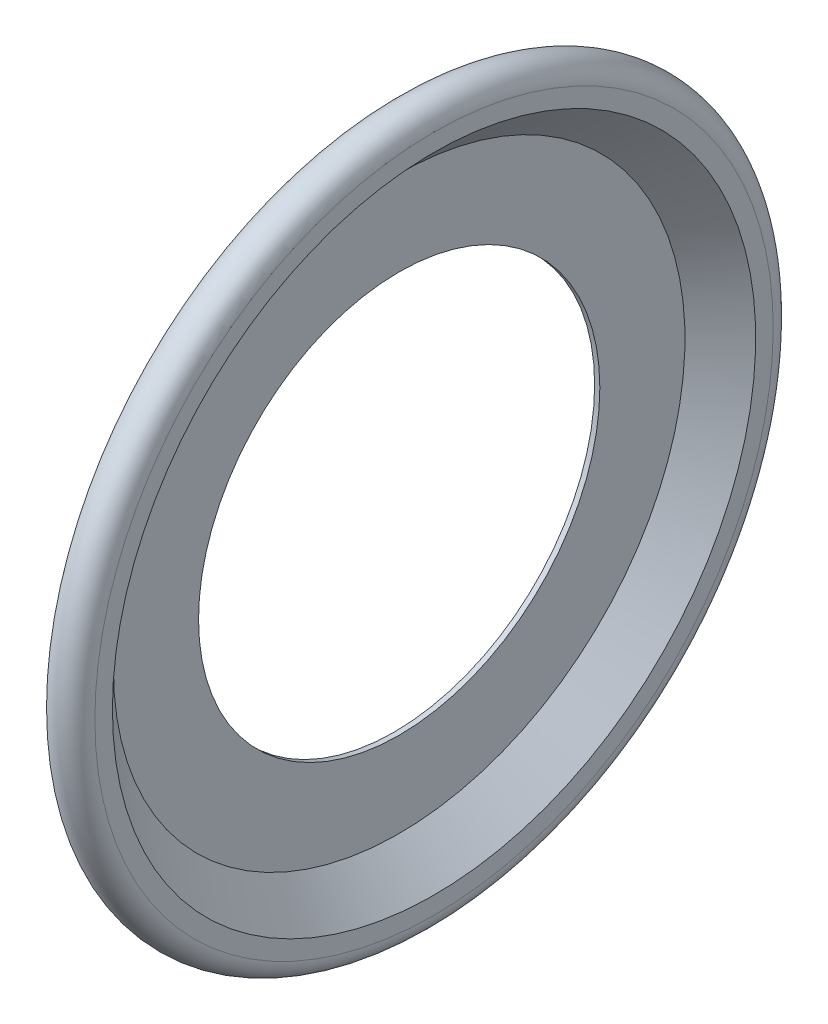
ISO-10303-21;
HEADER;
FILE_DESCRIPTION(('STEP AP214'),'2;1');
FILE_NAME('part.step','',(''),(''),'','','');
FILE_SCHEMA(('AUTOMOTIVE_DESIGN { 1 0 10303 214 1 1 1 1 }'));
ENDSEC;
DATA;
#1=APPLICATION_CONTEXT('core data for automotive mechanical design processes');
#2=APPLICATION_PROTOCOL_DEFINITION('international standard','automotive_design',2000,#1);
#3=PRODUCT_CONTEXT('',#1,'mechanical');
#4=PRODUCT('Part','Part','',(#3));
#5=PRODUCT_RELATED_PRODUCT_CATEGORY('part','',(#4));
#6=PRODUCT_DEFINITION_FORMATION('','',#4);
#7=PRODUCT_DEFINITION_CONTEXT('part definition',#1,'design');
#8=PRODUCT_DEFINITION('design','',#6,#7);
#9=PRODUCT_DEFINITION_SHAPE('','',#8);
#10=(LENGTH_UNIT() NAMED_UNIT(*) SI_UNIT(.MILLI.,.METRE.));
#11=(NAMED_UNIT(*) PLANE_ANGLE_UNIT() SI_UNIT($,.RADIAN.));
#12=(NAMED_UNIT(*) SI_UNIT($,.STERADIAN.) SOLID_ANGLE_UNIT());
#13=UNCERTAINTY_MEASURE_WITH_UNIT(LENGTH_MEASURE(1.E-05),#10,'distance_accuracy_value','');
#14=(GEOMETRIC_REPRESENTATION_CONTEXT(3) GLOBAL_UNCERTAINTY_ASSIGNED_CONTEXT((#13)) GLOBAL_UNIT_ASSIGNED_CONTEXT((#10,
#11,#12)) REPRESENTATION_CONTEXT('',''));
#15=CARTESIAN_POINT('',(0.,0.,0.));
#16=DIRECTION('',(0.,0.,1.));
#17=DIRECTION('',(1.,0.,0.));
#18=AXIS2_PLACEMENT_3D('',#15,#16,#17);
#19=CARTESIAN_POINT('',(0.28,0.,0.));
#20=DIRECTION('',(-1.,0.,0.));
#21=DIRECTION('',(0.,0.,1.));
#22=AXIS2_PLACEMENT_3D('',#19,#20,#21);
#23=TOROIDAL_SURFACE('',#22,3.38633333333333,0.2);
#24=CARTESIAN_POINT('',(0.0987384425926703,0.,0.));
#25=DIRECTION('',(-1.,0.,0.));
#26=DIRECTION('',(0.,0.,1.));
#27=AXIS2_PLACEMENT_3D('',#24,#25,#26);
#28=CIRCLE('',#27,3.47085698568148);
#29=CARTESIAN_POINT('',(0.0987384425926703,0.,3.47085698568148));
#30=VERTEX_POINT('',#29);
#31=EDGE_CURVE('E10',#30,#30,#28,.T.);
#32=ORIENTED_EDGE('',*,*,#31,.F.);
#33=EDGE_LOOP('',(#32));
#34=FACE_BOUND('',#33,.T.);
#35=CARTESIAN_POINT('',(0.48,0.,0.));
#36=DIRECTION('',(-1.,0.,0.));
#37=DIRECTION('',(0.,0.,1.));
#38=AXIS2_PLACEMENT_3D('',#35,#36,#37);
#39=CIRCLE('',#38,3.38633333333333);
#40=CARTESIAN_POINT('',(0.48,0.,3.38633333333333));
#41=VERTEX_POINT('',#40);
#42=EDGE_CURVE('E65',#41,#41,#39,.T.);
#43=ORIENTED_EDGE('',*,*,#42,.T.);
#44=EDGE_LOOP('',(#43));
#45=FACE_BOUND('',#44,.T.);
#46=ADVANCED_FACE('F15',(#34,#45),#23,.T.);
#47=CARTESIAN_POINT('',(0.0987384425926703,0.,0.));
#48=DIRECTION('',(-1.,0.,0.));
#49=DIRECTION('',(0.,0.,1.));
#50=AXIS2_PLACEMENT_3D('',#47,#48,#49);
#51=CONICAL_SURFACE('',#50,3.47085698568148,0.436332312998583);
#52=CARTESIAN_POINT('',(0.145866447518576,0.,0.));
#53=DIRECTION('',(-1.,0.,0.));
#54=DIRECTION('',(0.,0.,1.));
#55=AXIS2_PLACEMENT_3D('',#52,#53,#54);
#56=CIRCLE('',#55,3.44888083607095);
#57=CARTESIAN_POINT('',(0.145866447518576,0.,3.44888083607095));
#58=VERTEX_POINT('',#57);
#59=EDGE_CURVE('E22',#58,#58,#56,.T.);
#60=ORIENTED_EDGE('',*,*,#59,.F.);
#61=EDGE_LOOP('',(#60));
#62=FACE_BOUND('',#61,.T.);
#63=ORIENTED_EDGE('',*,*,#31,.T.);
#64=EDGE_LOOP('',(#63));
#65=FACE_BOUND('',#64,.T.);
#66=ADVANCED_FACE('F108',(#62,#65),#51,.F.);
#67=CARTESIAN_POINT('',(0.28,0.,0.));
#68=DIRECTION('',(-1.,0.,0.));
#69=DIRECTION('',(0.,0.,1.));
#70=AXIS2_PLACEMENT_3D('',#67,#68,#69);
#71=TOROIDAL_SURFACE('',#70,3.38633333333333,0.148);
#72=ORIENTED_EDGE('',*,*,#59,.T.);
#73=EDGE_LOOP('',(#72));
#74=FACE_BOUND('',#73,.T.);
#75=CARTESIAN_POINT('',(0.428,0.,0.));
#76=DIRECTION('',(-1.,0.,0.));
#77=DIRECTION('',(0.,0.,1.));
#78=AXIS2_PLACEMENT_3D('',#75,#76,#77);
#79=CIRCLE('',#78,3.38633333333333);
#80=CARTESIAN_POINT('',(0.428,0.,3.38633333333333));
#81=VERTEX_POINT('',#80);
#82=EDGE_CURVE('E31',#81,#81,#79,.T.);
#83=ORIENTED_EDGE('',*,*,#82,.F.);
#84=EDGE_LOOP('',(#83));
#85=FACE_BOUND('',#84,.T.);
#86=ADVANCED_FACE('F113',(#74,#85),#71,.F.);
#87=CARTESIAN_POINT('',(0.428,3.21133333333333,0.));
#88=DIRECTION('',(-1.,0.,0.));
#89=DIRECTION('',(0.,0.,1.));
#90=AXIS2_PLACEMENT_3D('',#87,#88,#89);
#91=PLANE('',#90);
#92=ORIENTED_EDGE('',*,*,#82,.T.);
#93=EDGE_LOOP('',(#92));
#94=FACE_BOUND('',#93,.T.);
#95=CARTESIAN_POINT('',(0.428,0.,0.));
#96=DIRECTION('',(-1.,0.,0.));
#97=DIRECTION('',(0.,0.,1.));
#98=AXIS2_PLACEMENT_3D('',#95,#96,#97);
#99=CIRCLE('',#98,3.21133333333333);
#100=CARTESIAN_POINT('',(0.428,0.,3.21133333333333));
#101=VERTEX_POINT('',#100);
#102=EDGE_CURVE('E39',#101,#101,#99,.T.);
#103=ORIENTED_EDGE('',*,*,#102,.F.);
#104=EDGE_LOOP('',(#103));
#105=FACE_BOUND('',#104,.T.);
#106=ADVANCED_FACE('F104',(#94,#105),#91,.T.);
#107=CARTESIAN_POINT('',(0.08,0.,0.));
#108=DIRECTION('',(1.,0.,0.));
#109=DIRECTION('',(0.,0.,-1.));
#110=AXIS2_PLACEMENT_3D('',#107,#108,#109);
#111=CONICAL_SURFACE('',#110,2.85333333333333,0.799561522210406);
#112=ORIENTED_EDGE('',*,*,#102,.T.);
#113=EDGE_LOOP('',(#112));
#114=FACE_BOUND('',#113,.T.);
#115=CARTESIAN_POINT('',(0.08,0.,0.));
#116=DIRECTION('',(-1.,0.,0.));
#117=DIRECTION('',(0.,0.,1.));
#118=AXIS2_PLACEMENT_3D('',#115,#116,#117);
#119=CIRCLE('',#118,2.85333333333333);
#120=CARTESIAN_POINT('',(0.08,0.,2.85333333333333));
#121=VERTEX_POINT('',#120);
#122=EDGE_CURVE('E45',#121,#121,#119,.T.);
#123=ORIENTED_EDGE('',*,*,#122,.F.);
#124=EDGE_LOOP('',(#123));
#125=FACE_BOUND('',#124,.T.);
#126=ADVANCED_FACE('F97',(#114,#125),#111,.T.);
#127=CARTESIAN_POINT('',(0.08,2.00333333333333,0.));
#128=DIRECTION('',(-1.,0.,0.));
#129=DIRECTION('',(0.,0.,1.));
#130=AXIS2_PLACEMENT_3D('',#127,#128,#129);
#131=PLANE('',#130);
#132=ORIENTED_EDGE('',*,*,#122,.T.);
#133=EDGE_LOOP('',(#132));
#134=FACE_BOUND('',#133,.T.);
#135=CARTESIAN_POINT('',(0.08,0.,0.));
#136=DIRECTION('',(-1.,0.,0.));
#137=DIRECTION('',(0.,0.,1.));
#138=AXIS2_PLACEMENT_3D('',#135,#136,#137);
#139=CIRCLE('',#138,2.00333333333333);
#140=CARTESIAN_POINT('',(0.08,0.,2.00333333333333));
#141=VERTEX_POINT('',#140);
#142=EDGE_CURVE('E49',#141,#141,#139,.T.);
#143=ORIENTED_EDGE('',*,*,#142,.F.);
#144=EDGE_LOOP('',(#143));
#145=FACE_BOUND('',#144,.T.);
#146=ADVANCED_FACE('F92',(#134,#145),#131,.T.);
#147=CARTESIAN_POINT('',(0.,0.,0.));
#148=DIRECTION('',(-1.,0.,0.));
#149=DIRECTION('',(0.,0.,1.));
#150=AXIS2_PLACEMENT_3D('',#147,#148,#149);
#151=CYLINDRICAL_SURFACE('',#150,2.00333333333333);
#152=CARTESIAN_POINT('',(0.132,0.,0.));
#153=DIRECTION('',(-1.,0.,0.));
#154=DIRECTION('',(0.,0.,1.));
#155=AXIS2_PLACEMENT_3D('',#152,#153,#154);
#156=CIRCLE('',#155,2.00333333333333);
#157=CARTESIAN_POINT('',(0.132,0.,2.00333333333333));
#158=VERTEX_POINT('',#157);
#159=EDGE_CURVE('E53',#158,#158,#156,.T.);
#160=ORIENTED_EDGE('',*,*,#159,.F.);
#161=EDGE_LOOP('',(#160));
#162=FACE_BOUND('',#161,.T.);
#163=ORIENTED_EDGE('',*,*,#142,.T.);
#164=EDGE_LOOP('',(#163));
#165=FACE_BOUND('',#164,.T.);
#166=ADVANCED_FACE('F86',(#162,#165),#151,.F.);
#167=CARTESIAN_POINT('',(0.132,2.00333333333333,0.));
#168=DIRECTION('',(-1.,0.,0.));
#169=DIRECTION('',(0.,0.,1.));
#170=AXIS2_PLACEMENT_3D('',#167,#168,#169);
#171=PLANE('',#170);
#172=CARTESIAN_POINT('',(0.132,0.,0.));
#173=DIRECTION('',(-1.,0.,0.));
#174=DIRECTION('',(0.,0.,1.));
#175=AXIS2_PLACEMENT_3D('',#172,#173,#174);
#176=CIRCLE('',#175,2.85333333333333);
#177=CARTESIAN_POINT('',(0.132,0.,2.85333333333333));
#178=VERTEX_POINT('',#177);
#179=EDGE_CURVE('E57',#178,#178,#176,.T.);
#180=ORIENTED_EDGE('',*,*,#179,.F.);
#181=EDGE_LOOP('',(#180));
#182=FACE_BOUND('',#181,.T.);
#183=ORIENTED_EDGE('',*,*,#159,.T.);
#184=EDGE_LOOP('',(#183));
#185=FACE_BOUND('',#184,.T.);
#186=ADVANCED_FACE('F80',(#182,#185),#171,.F.);
#187=CARTESIAN_POINT('',(0.132,0.,0.));
#188=DIRECTION('',(1.,0.,0.));
#189=DIRECTION('',(0.,0.,-1.));
#190=AXIS2_PLACEMENT_3D('',#187,#188,#189);
#191=CONICAL_SURFACE('',#190,2.85333333333333,0.799561522210406);
#192=CARTESIAN_POINT('',(0.48,0.,0.));
#193=DIRECTION('',(-1.,0.,0.));
#194=DIRECTION('',(0.,0.,1.));
#195=AXIS2_PLACEMENT_3D('',#192,#193,#194);
#196=CIRCLE('',#195,3.21133333333333);
#197=CARTESIAN_POINT('',(0.48,0.,3.21133333333333));
#198=VERTEX_POINT('',#197);
#199=EDGE_CURVE('E61',#198,#198,#196,.T.);
#200=ORIENTED_EDGE('',*,*,#199,.F.);
#201=EDGE_LOOP('',(#200));
#202=FACE_BOUND('',#201,.T.);
#203=ORIENTED_EDGE('',*,*,#179,.T.);
#204=EDGE_LOOP('',(#203));
#205=FACE_BOUND('',#204,.T.);
#206=ADVANCED_FACE('F74',(#202,#205),#191,.F.);
#207=CARTESIAN_POINT('',(0.48,3.21133333333333,0.));
#208=DIRECTION('',(-1.,0.,0.));
#209=DIRECTION('',(0.,0.,1.));
#210=AXIS2_PLACEMENT_3D('',#207,#208,#209);
#211=PLANE('',#210);
#212=ORIENTED_EDGE('',*,*,#42,.F.);
#213=EDGE_LOOP('',(#212));
#214=FACE_BOUND('',#213,.T.);
#215=ORIENTED_EDGE('',*,*,#199,.T.);
#216=EDGE_LOOP('',(#215));
#217=FACE_BOUND('',#216,.T.);
#218=ADVANCED_FACE('F71',(#214,#217),#211,.F.);
#219=CLOSED_SHELL('',(#46,#66,#86,#106,#126,#146,#166,#186,#206,#218));
#220=MANIFOLD_SOLID_BREP('B1',#219);
#221=ADVANCED_BREP_SHAPE_REPRESENTATION('',(#18,#220),#14);
#222=SHAPE_DEFINITION_REPRESENTATION(#9,#221);
ENDSEC;
END-ISO-10303-21;
